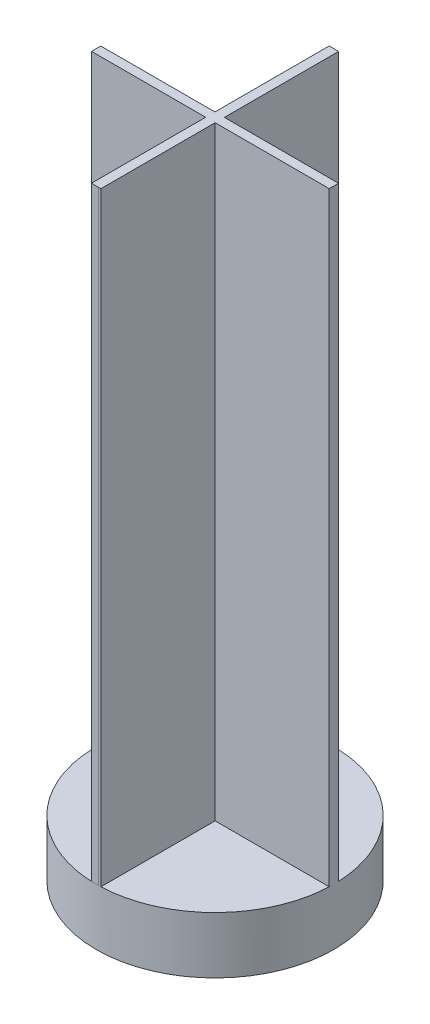
ISO-10303-21;
HEADER;
FILE_DESCRIPTION(('STEP AP214'),'2;1');
FILE_NAME('part.step','',(''),(''),'','','');
FILE_SCHEMA(('AUTOMOTIVE_DESIGN { 1 0 10303 214 1 1 1 1 }'));
ENDSEC;
DATA;
#1=APPLICATION_CONTEXT('core data for automotive mechanical design processes');
#2=APPLICATION_PROTOCOL_DEFINITION('international standard','automotive_design',2000,#1);
#3=PRODUCT_CONTEXT('',#1,'mechanical');
#4=PRODUCT('Part','Part','',(#3));
#5=PRODUCT_RELATED_PRODUCT_CATEGORY('part','',(#4));
#6=PRODUCT_DEFINITION_FORMATION('','',#4);
#7=PRODUCT_DEFINITION_CONTEXT('part definition',#1,'design');
#8=PRODUCT_DEFINITION('design','',#6,#7);
#9=PRODUCT_DEFINITION_SHAPE('','',#8);
#10=(LENGTH_UNIT() NAMED_UNIT(*) SI_UNIT(.MILLI.,.METRE.));
#11=(NAMED_UNIT(*) PLANE_ANGLE_UNIT() SI_UNIT($,.RADIAN.));
#12=(NAMED_UNIT(*) SI_UNIT($,.STERADIAN.) SOLID_ANGLE_UNIT());
#13=UNCERTAINTY_MEASURE_WITH_UNIT(LENGTH_MEASURE(1.E-05),#10,'distance_accuracy_value','');
#14=(GEOMETRIC_REPRESENTATION_CONTEXT(3) GLOBAL_UNCERTAINTY_ASSIGNED_CONTEXT((#13)) GLOBAL_UNIT_ASSIGNED_CONTEXT((#10,
#11,#12)) REPRESENTATION_CONTEXT('',''));
#15=CARTESIAN_POINT('',(0.,0.,0.));
#16=DIRECTION('',(0.,0.,1.));
#17=DIRECTION('',(1.,0.,0.));
#18=AXIS2_PLACEMENT_3D('',#15,#16,#17);
#19=CARTESIAN_POINT('',(-60.677031052405,-55.4908316577936,43.5017818594155));
#20=DIRECTION('',(0.,1.,0.));
#21=DIRECTION('',(0.,0.,1.));
#22=AXIS2_PLACEMENT_3D('',#19,#20,#21);
#23=PLANE('',#22);
#24=CARTESIAN_POINT('',(-20.7335158678154,-55.4908316577936,42.723897789482));
#25=CARTESIAN_POINT('',(-20.7452794277928,-55.4908316577936,42.4125955628972));
#26=CARTESIAN_POINT('',(-20.7642376178542,-55.4908316577936,42.1015552659481));
#27=CARTESIAN_POINT('',(-20.8165410225871,-55.4908316577936,41.4823149107754));
#28=CARTESIAN_POINT('',(-20.849811028162,-55.4908316577936,41.1741084907198));
#29=CARTESIAN_POINT('',(-20.9307331896234,-55.4908316577936,40.5605333148271));
#30=CARTESIAN_POINT('',(-20.9783415947686,-55.4908316577936,40.255158799326));
#31=CARTESIAN_POINT('',(-21.0879015910903,-55.4908316577936,39.6472471810869));
#32=CARTESIAN_POINT('',(-21.1498416036294,-55.4908316577936,39.3447079918745));
#33=CARTESIAN_POINT('',(-21.288033683538,-55.4908316577936,38.7424638498737));
#34=CARTESIAN_POINT('',(-21.364306039139,-55.4908316577936,38.4427635552714));
#35=CARTESIAN_POINT('',(-21.5311324613245,-55.4908316577936,37.8461847880544));
#36=CARTESIAN_POINT('',(-21.6217375547625,-55.4908316577936,37.5493205767422));
#37=CARTESIAN_POINT('',(-21.7970764175939,-55.4908316577936,37.0192356465199));
#38=CARTESIAN_POINT('',(-21.8793416515878,-55.4908316577936,36.7851945870201));
#39=CARTESIAN_POINT('',(-22.052875938155,-55.4908316577936,36.3188918143077));
#40=CARTESIAN_POINT('',(-22.1441957307309,-55.4908316577936,36.0866490191909));
#41=CARTESIAN_POINT('',(-22.3840215118189,-55.4908316577936,35.5076142492955));
#42=CARTESIAN_POINT('',(-22.5378776223811,-55.4908316577936,35.1630211416082));
#43=CARTESIAN_POINT('',(-22.8634002752838,-55.4908316577936,34.4856684349671));
#44=CARTESIAN_POINT('',(-23.0349178509987,-55.4908316577936,34.1528372813757));
#45=CARTESIAN_POINT('',(-23.3651473616546,-55.4908316577936,33.5543438602712));
#46=CARTESIAN_POINT('',(-23.5209129093476,-55.4908316577936,33.2870520365441));
#47=CARTESIAN_POINT('',(-23.8446246141413,-55.4908316577936,32.7605809662016));
#48=CARTESIAN_POINT('',(-24.0125491785997,-55.4908316577936,32.5013884542983));
#49=CARTESIAN_POINT('',(-24.3605480264003,-55.4908316577936,31.991106267374));
#50=CARTESIAN_POINT('',(-24.5406282741264,-55.4908316577936,31.7400206607801));
#51=CARTESIAN_POINT('',(-24.9129112956881,-55.4908316577936,31.245932966793));
#52=CARTESIAN_POINT('',(-25.1051457236619,-55.4908316577936,31.0029547353754));
#53=CARTESIAN_POINT('',(-25.5025429049437,-55.4908316577936,30.5240615438446));
#54=CARTESIAN_POINT('',(-25.7078075144622,-55.4908316577936,30.2882311357692));
#55=CARTESIAN_POINT('',(-26.1305094568579,-55.4908316577936,29.8246782425956));
#56=CARTESIAN_POINT('',(-26.3480227892681,-55.4908316577936,29.5970251137229));
#57=CARTESIAN_POINT('',(-26.7912632758206,-55.4908316577936,29.1537578605114));
#58=CARTESIAN_POINT('',(-27.0169037986522,-55.4908316577936,28.9380571024273));
#59=CARTESIAN_POINT('',(-27.4763206186723,-55.4908316577936,28.5187622579054));
#60=CARTESIAN_POINT('',(-27.7100298731406,-55.4908316577936,28.3150947726353));
#61=CARTESIAN_POINT('',(-28.1865477783414,-55.4908316577936,27.9190255317051));
#62=CARTESIAN_POINT('',(-28.4293502667884,-55.4908316577936,27.7266163652479));
#63=CARTESIAN_POINT('',(-28.9231100012591,-55.4908316577936,27.3539675738878));
#64=CARTESIAN_POINT('',(-29.1740438518854,-55.4908316577936,27.1736969562072));
#65=CARTESIAN_POINT('',(-29.6840460298808,-55.4908316577936,26.8253006712829));
#66=CARTESIAN_POINT('',(-29.9431107455028,-55.4908316577936,26.6571697181216));
#67=CARTESIAN_POINT('',(-30.4693494256853,-55.4908316577936,26.333028411458));
#68=CARTESIAN_POINT('',(-30.7365370981362,-55.4908316577936,26.177040332232));
#69=CARTESIAN_POINT('',(-31.3371028308648,-55.4908316577936,25.8450447018935));
#70=CARTESIAN_POINT('',(-31.6721850195755,-55.4908316577936,25.6721123368095));
#71=CARTESIAN_POINT('',(-32.3542342166158,-55.4908316577936,25.3439728610081));
#72=CARTESIAN_POINT('',(-32.701275094562,-55.4908316577936,25.188919363958));
#73=CARTESIAN_POINT('',(-33.2803227495023,-55.4908316577936,24.9490468600797));
#74=CARTESIAN_POINT('',(-33.510038104769,-55.4908316577936,24.8586520742345));
#75=CARTESIAN_POINT('',(-33.9712664806068,-55.4908316577936,24.6867764490576));
#76=CARTESIAN_POINT('',(-34.2027613077415,-55.4908316577936,24.6052468803915));
#77=CARTESIAN_POINT('',(-34.7301599950448,-55.4908316577936,24.4303260643861));
#78=CARTESIAN_POINT('',(-35.0269169262593,-55.4908316577936,24.339494595567));
#79=CARTESIAN_POINT('',(-35.6233091132688,-55.4908316577936,24.1722094272952));
#80=CARTESIAN_POINT('',(-35.922930282604,-55.4908316577936,24.0957054780134));
#81=CARTESIAN_POINT('',(-36.5250442269977,-55.4908316577936,23.9570437071814));
#82=CARTESIAN_POINT('',(-36.8275325109024,-55.4908316577936,23.8948663953389));
#83=CARTESIAN_POINT('',(-37.4353703665104,-55.4908316577936,23.7848254132964));
#84=CARTESIAN_POINT('',(-37.740722179288,-55.4908316577936,23.7369741239969));
#85=CARTESIAN_POINT('',(-38.3542800040165,-55.4908316577936,23.6555597655336));
#86=CARTESIAN_POINT('',(-38.6624919155786,-55.4908316577936,23.6220412385855));
#87=CARTESIAN_POINT('',(-39.2817713724816,-55.4908316577936,23.5692344209751));
#88=CARTESIAN_POINT('',(-39.5928454057531,-55.4908316577936,23.5500221034623));
#89=CARTESIAN_POINT('',(-39.9041870568331,-55.4908316577936,23.5380024442502));
#90=B_SPLINE_CURVE_WITH_KNOTS('',3,(#24,#25,#26,#27,#28,#29,#30,#31,#32,#33,#34,#35,#36,#37,#38,
#39,#40,#41,#42,#43,#44,#45,#46,#47,#48,#49,#50,#51,#52,#53,#54,#55,#56,#57,#58,#59,#60,#61,#62,
#63,#64,#65,#66,#67,#68,#69,#70,#71,#72,#73,#74,#75,#76,#77,#78,#79,#80,#81,#82,#83,#84,#85,#86,
#87,#88,#89),.UNSPECIFIED.,.F.,.F.,(4,2,2,2,2,2,2,2,2,2,2,2,2,2,2,2,2,2,2,2,2,2,2,2,2,2,2,2,2,2,
2,2,4),(0.,0.934504975178753,1.86415796135463,2.79100255329524,3.71710093756409,
4.64452027848448,5.57531893948107,6.31938896279196,7.06789359117786,8.1994320556373,
9.32210619806125,10.2498738264638,11.1760324784932,12.1026489158491,13.031786845362,
13.9693924849792,14.9136470834744,15.8497885844915,16.7794571380115,17.7085066879348,
18.6350863657348,19.5612601233219,20.4890946214983,21.6197037082976,22.759398701584,
23.4998367435445,24.2359737179861,25.1666625915118,26.0940235617331,27.0201153799168,
27.9470052542577,28.8767550697654,29.8114077841729),.UNSPECIFIED.);
#91=CARTESIAN_POINT('',(-20.7337624723655,-55.4908316577936,42.7239073980584));
#92=VERTEX_POINT('',#91);
#93=CARTESIAN_POINT('',(-39.9041963511059,-55.4908316577936,23.5382362039433));
#94=VERTEX_POINT('',#93);
#95=EDGE_CURVE('E49',#92,#94,#90,.T.);
#96=ORIENTED_EDGE('',*,*,#95,.T.);
#97=DIRECTION('',(0.,0.,1.));
#98=VECTOR('',#97,1.);
#99=CARTESIAN_POINT('',(-39.9041958539564,-55.4908316577936,0.));
#100=LINE('',#99,#98);
#101=CARTESIAN_POINT('',(-39.9041958539564,-55.4908316577936,42.7239068594155));
#102=VERTEX_POINT('',#101);
#103=EDGE_CURVE('E56',#94,#102,#100,.T.);
#104=ORIENTED_EDGE('',*,*,#103,.T.);
#105=DIRECTION('',(-1.,0.,0.));
#106=VECTOR('',#105,1.);
#107=CARTESIAN_POINT('',(0.,-55.4908316577936,42.7239068594155));
#108=LINE('',#107,#106);
#109=EDGE_CURVE('E164',#92,#102,#108,.T.);
#110=ORIENTED_EDGE('',*,*,#109,.F.);
#111=EDGE_LOOP('',(#96,#104,#110));
#112=FACE_BOUND('',#111,.T.);
#113=ADVANCED_FACE('F38',(#112),#23,.T.);
#114=CARTESIAN_POINT('',(-60.6623758400974,-55.4908316577936,44.2796659293489));
#115=CARTESIAN_POINT('',(-60.6506123055585,-55.4908316577936,44.5909674788356));
#116=CARTESIAN_POINT('',(-60.6316541724291,-55.4908316577936,44.902007099799));
#117=CARTESIAN_POINT('',(-60.5793509444297,-55.4908316577936,45.5212461154148));
#118=CARTESIAN_POINT('',(-60.5460810582315,-55.4908316577936,45.8294518718557));
#119=CARTESIAN_POINT('',(-60.4651591983496,-55.4908316577936,46.4430257329184));
#120=CARTESIAN_POINT('',(-60.4175509752602,-55.4908316577936,46.7483995971759));
#121=CARTESIAN_POINT('',(-60.307991405537,-55.4908316577936,47.3563099252973));
#122=CARTESIAN_POINT('',(-60.2460516376752,-55.4908316577936,47.6588484756561));
#123=CARTESIAN_POINT('',(-60.1078601093138,-55.4908316577936,48.2610913523281));
#124=CARTESIAN_POINT('',(-60.0315880609897,-55.4908316577936,48.5607910205575));
#125=CARTESIAN_POINT('',(-59.8647623153792,-55.4908316577936,49.1573685470708));
#126=CARTESIAN_POINT('',(-59.7741575918998,-55.4908316577936,49.4542321442643));
#127=CARTESIAN_POINT('',(-59.5988186340636,-55.4908316577936,49.9843184446083));
#128=CARTESIAN_POINT('',(-59.5165528342472,-55.4908316577936,50.218361453017));
#129=CARTESIAN_POINT('',(-59.3430172679428,-55.4908316577936,50.6846680943854));
#130=CARTESIAN_POINT('',(-59.2516967602823,-55.4908316577936,50.916912808831));
#131=CARTESIAN_POINT('',(-59.011871496993,-55.4908316577936,51.4959463287887));
#132=CARTESIAN_POINT('',(-58.8580168593905,-55.4908316577936,51.8405363651523));
#133=CARTESIAN_POINT('',(-58.5324974765071,-55.4908316577936,52.5178831444622));
#134=CARTESIAN_POINT('',(-58.3609816943504,-55.4908316577936,52.8507114402703));
#135=CARTESIAN_POINT('',(-58.0307547345483,-55.4908316577936,53.4492016866834));
#136=CARTESIAN_POINT('',(-57.8749898052803,-55.4908316577936,53.7164931125663));
#137=CARTESIAN_POINT('',(-57.5512793899911,-55.4908316577936,54.2429634221642));
#138=CARTESIAN_POINT('',(-57.3833554971485,-55.4908316577936,54.5021555714633));
#139=CARTESIAN_POINT('',(-57.035358044825,-55.4908316577936,55.0124370682635));
#140=CARTESIAN_POINT('',(-56.8552785216991,-55.4908316577936,55.2635223478526));
#141=CARTESIAN_POINT('',(-56.4829970017593,-55.4908316577936,55.7576094222915));
#142=CARTESIAN_POINT('',(-56.2907633517109,-55.4908316577936,56.0005873619121));
#143=CARTESIAN_POINT('',(-55.8933642993509,-55.4908316577936,56.4794841993756));
#144=CARTESIAN_POINT('',(-55.688096844387,-55.4908316577936,56.7153183823756));
#145=CARTESIAN_POINT('',(-55.2653888408836,-55.4908316577936,57.1788785790869));
#146=CARTESIAN_POINT('',(-55.0478722896254,-55.4908316577936,57.4065352337663));
#147=CARTESIAN_POINT('',(-54.604632765602,-55.4908316577936,57.849801524704));
#148=CARTESIAN_POINT('',(-54.3789967729509,-55.4908316577936,58.0654981435608));
#149=CARTESIAN_POINT('',(-53.9195893354124,-55.4908316577936,58.4847851888815));
#150=CARTESIAN_POINT('',(-53.6858849297296,-55.4908316577936,58.6884490101933));
#151=CARTESIAN_POINT('',(-53.2093728935975,-55.4908316577936,59.084514852421));
#152=CARTESIAN_POINT('',(-52.9665712632909,-55.4908316577936,59.2769240891118));
#153=CARTESIAN_POINT('',(-52.4728132795367,-55.4908316577936,59.6495730714358));
#154=CARTESIAN_POINT('',(-52.2218803221973,-55.4908316577936,59.8298438106661));
#155=CARTESIAN_POINT('',(-51.7118799675439,-55.4908316577936,60.1782403964075));
#156=CARTESIAN_POINT('',(-51.4528161827657,-55.4908316577936,60.3463715299659));
#157=CARTESIAN_POINT('',(-50.9265793906807,-55.4908316577936,60.6705132279386));
#158=CARTESIAN_POINT('',(-50.6593926762885,-55.4908316577936,60.8265015194783));
#159=CARTESIAN_POINT('',(-50.0588218756892,-55.4908316577936,61.1585017784865));
#160=CARTESIAN_POINT('',(-49.7237334397449,-55.4908316577936,61.3314381827468));
#161=CARTESIAN_POINT('',(-49.0416711117846,-55.4908316577936,61.6595846365642));
#162=CARTESIAN_POINT('',(-48.6946233448054,-55.4908316577936,61.8146410613462));
#163=CARTESIAN_POINT('',(-48.1155569173154,-55.4908316577936,62.0545221749155));
#164=CARTESIAN_POINT('',(-47.8858294749244,-55.4908316577936,62.1449221574728));
#165=CARTESIAN_POINT('',(-47.4245812962244,-55.4908316577936,62.316807193831));
#166=CARTESIAN_POINT('',(-47.1930788079382,-55.4908316577936,62.3983411225853));
#167=CARTESIAN_POINT('',(-46.6656589123714,-55.4908316577936,62.5732732106194));
#168=CARTESIAN_POINT('',(-46.3688883625285,-55.4908316577936,62.6641114498384));
#169=CARTESIAN_POINT('',(-45.7724756288436,-55.4908316577936,62.8314071099592));
#170=CARTESIAN_POINT('',(-45.4728476258834,-55.4908316577936,62.9079151159179));
#171=CARTESIAN_POINT('',(-44.8707267062499,-55.4908316577936,63.0465819095086));
#172=CARTESIAN_POINT('',(-44.5682383587629,-55.4908316577936,63.108760525482));
#173=CARTESIAN_POINT('',(-43.960407091061,-55.4908316577936,63.2188010358967));
#174=CARTESIAN_POINT('',(-43.6550619900343,-55.4908316577936,63.2666508825006));
#175=CARTESIAN_POINT('',(-43.0415243142871,-55.4908316577936,63.3480592747923));
#176=CARTESIAN_POINT('',(-42.7333258825989,-55.4908316577936,63.381573598883));
#177=CARTESIAN_POINT('',(-42.1140801561339,-55.4908316577936,63.434368968819));
#178=CARTESIAN_POINT('',(-41.8030264001867,-55.4908316577936,63.4535743420843));
#179=CARTESIAN_POINT('',(-41.4917051013596,-55.4908316577936,63.4655856597542));
#180=B_SPLINE_CURVE_WITH_KNOTS('',3,(#114,#115,#116,#117,#118,#119,#120,#121,#122,#123,#124,
#125,#126,#127,#128,#129,#130,#131,#132,#133,#134,#135,#136,#137,#138,#139,#140,#141,#142,#143,
#144,#145,#146,#147,#148,#149,#150,#151,#152,#153,#154,#155,#156,#157,#158,#159,#160,#161,#162,
#163,#164,#165,#166,#167,#168,#169,#170,#171,#172,#173,#174,#175,#176,#177,#178,#179),
.UNSPECIFIED.,.F.,.F.,(4,2,2,2,2,2,2,2,2,2,2,2,2,2,2,2,2,2,2,2,2,2,2,2,2,2,2,2,2,2,2,2,4),(0.,
0.934502942884559,1.86415391350205,2.79099649316754,3.71709285488847,4.64451014947887,
5.57530672705036,6.31938282484036,7.06789359244494,8.19942185939722,9.32208593299595,
10.2498515978775,11.1760082438814,12.1026226190896,13.0317584171021,13.9693781870187,
14.9136470872256,15.8497702045447,16.7794205906164,17.7084682549039,18.63504597254,
19.5612176815237,20.489050029324,21.6196812669384,22.7593986995601,23.4998762168199,
24.2360392449146,25.1667731116013,26.0941569211985,27.0202496500764,27.9471188787868,
28.8768270073151,29.8114176416814),.UNSPECIFIED.);
#181=CARTESIAN_POINT('',(-60.6621292355472,-55.4908316577936,44.2796563207725));
#182=VERTEX_POINT('',#181);
#183=CARTESIAN_POINT('',(-41.4916953227263,-55.4908316577936,63.465339717781));
#184=VERTEX_POINT('',#183);
#185=EDGE_CURVE('E277',#182,#184,#180,.T.);
#186=ORIENTED_EDGE('',*,*,#185,.T.);
#187=DIRECTION('',(0.,0.,-1.));
#188=VECTOR('',#187,1.);
#189=CARTESIAN_POINT('',(-41.4916958539564,-55.4908316577936,0.));
#190=LINE('',#189,#188);
#191=CARTESIAN_POINT('',(-41.4916958539564,-55.4908316577936,44.2796568594155));
#192=VERTEX_POINT('',#191);
#193=EDGE_CURVE('E292',#184,#192,#190,.T.);
#194=ORIENTED_EDGE('',*,*,#193,.T.);
#195=DIRECTION('',(1.,0.,0.));
#196=VECTOR('',#195,1.);
#197=CARTESIAN_POINT('',(0.,-55.4908316577936,44.2796568594155));
#198=LINE('',#197,#196);
#199=EDGE_CURVE('E283',#182,#192,#198,.T.);
#200=ORIENTED_EDGE('',*,*,#199,.F.);
#201=EDGE_LOOP('',(#186,#194,#200));
#202=FACE_BOUND('',#201,.T.);
#203=ADVANCED_FACE('F350',(#202),#23,.T.);
#204=DIRECTION('',(-1.,0.,0.));
#205=VECTOR('',#204,1.);
#206=CARTESIAN_POINT('',(0.,-55.4908316577936,42.7239068594155));
#207=LINE('',#206,#205);
#208=CARTESIAN_POINT('',(-41.4916958539564,-55.4908316577936,42.7239068594155));
#209=VERTEX_POINT('',#208);
#210=CARTESIAN_POINT('',(-60.6621078343695,-55.4908316577936,42.7239073354251));
#211=VERTEX_POINT('',#210);
#212=EDGE_CURVE('E293',#209,#211,#207,.T.);
#213=ORIENTED_EDGE('',*,*,#212,.F.);
#214=DIRECTION('',(0.,0.,-1.));
#215=VECTOR('',#214,1.);
#216=CARTESIAN_POINT('',(-41.4916958539564,-55.4908316577936,0.));
#217=LINE('',#216,#215);
#218=CARTESIAN_POINT('',(-41.4916952891315,-55.4908316577936,23.538214518643));
#219=VERTEX_POINT('',#218);
#220=EDGE_CURVE('E144',#209,#219,#217,.T.);
#221=ORIENTED_EDGE('',*,*,#220,.T.);
#222=CARTESIAN_POINT('',(-41.4917054441311,-55.4908316577936,23.5379591105629));
#223=CARTESIAN_POINT('',(-41.8029653857158,-55.4908316577936,23.5499645486898));
#224=CARTESIAN_POINT('',(-42.1139576540318,-55.4908316577936,23.569165591204));
#225=CARTESIAN_POINT('',(-42.7331019503782,-55.4908316577936,23.6219541629956));
#226=CARTESIAN_POINT('',(-43.0412603552457,-55.4908316577936,23.6554670083335));
#227=CARTESIAN_POINT('',(-43.6547394770576,-55.4908316577936,23.7368743116619));
#228=CARTESIAN_POINT('',(-43.9600659173957,-55.4908316577936,23.7847255615575));
#229=CARTESIAN_POINT('',(-44.567881448113,-55.4908316577936,23.8947706963278));
#230=CARTESIAN_POINT('',(-44.8703725359329,-55.4908316577936,23.9569535472998));
#231=CARTESIAN_POINT('',(-45.4725205273014,-55.4908316577936,24.0956307334581));
#232=CARTESIAN_POINT('',(-45.7721726327611,-55.4908316577936,24.172145889338));
#233=CARTESIAN_POINT('',(-46.3686553459997,-55.4908316577936,24.339457449719));
#234=CARTESIAN_POINT('',(-46.6654715072982,-55.4908316577936,24.4303053876427));
#235=CARTESIAN_POINT('',(-47.192953279431,-55.4908316577936,24.605244651021));
#236=CARTESIAN_POINT('',(-47.42447202098,-55.4908316577936,24.6867759497907));
#237=CARTESIAN_POINT('',(-47.8857677353458,-55.4908316577936,24.8586517413821));
#238=CARTESIAN_POINT('',(-48.1155263271859,-55.4908316577936,24.9490454735234));
#239=CARTESIAN_POINT('',(-48.6945523888613,-55.4908316577936,25.1888677194345));
#240=CARTESIAN_POINT('',(-49.0415305415346,-55.4908316577936,25.3438682137773));
#241=CARTESIAN_POINT('',(-49.7234854588732,-55.4908316577936,25.6719322191849));
#242=CARTESIAN_POINT('',(-50.0585351654151,-55.4908316577936,25.8448440314058));
#243=CARTESIAN_POINT('',(-50.6590345568157,-55.4908316577936,26.1768033913067));
#244=CARTESIAN_POINT('',(-50.9261889246749,-55.4908316577936,26.3327748449787));
#245=CARTESIAN_POINT('',(-51.4523855010648,-55.4908316577936,26.656897930762));
#246=CARTESIAN_POINT('',(-51.7114407039751,-55.4908316577936,26.8250284485307));
#247=CARTESIAN_POINT('',(-52.2214484760208,-55.4908316577936,27.1734386685033));
#248=CARTESIAN_POINT('',(-52.4723966603176,-55.4908316577936,27.3537247878007));
#249=CARTESIAN_POINT('',(-52.9662099771733,-55.4908316577936,27.7264192380829));
#250=CARTESIAN_POINT('',(-53.2090509009764,-55.4908316577936,27.9188596388155));
#251=CARTESIAN_POINT('',(-53.6856348533605,-55.4908316577936,28.3149781872562));
#252=CARTESIAN_POINT('',(-53.9193722203551,-55.4908316577936,28.5186631435732));
#253=CARTESIAN_POINT('',(-54.3788750883864,-55.4908316577936,28.9380013254859));
#254=CARTESIAN_POINT('',(-54.6045727800948,-55.4908316577936,29.1537287959313));
#255=CARTESIAN_POINT('',(-55.0478393452229,-55.4908316577936,29.596968727613));
#256=CARTESIAN_POINT('',(-55.2653254596911,-55.4908316577936,29.8245639640135));
#257=CARTESIAN_POINT('',(-55.6879832963103,-55.4908316577936,30.2880297873935));
#258=CARTESIAN_POINT('',(-55.8932301487244,-55.4908316577936,30.5238318052535));
#259=CARTESIAN_POINT('',(-56.2905779390157,-55.4908316577936,31.0026590008567));
#260=CARTESIAN_POINT('',(-56.482781348594,-55.4908316577936,31.245599116265));
#261=CARTESIAN_POINT('',(-56.8550191535451,-55.4908316577936,31.7396338606436));
#262=CARTESIAN_POINT('',(-57.0350841249854,-55.4908316577936,31.9907054464979));
#263=CARTESIAN_POINT('',(-57.3830694965341,-55.4908316577936,32.5009826611002));
#264=CARTESIAN_POINT('',(-57.5509947291693,-55.4908316577936,32.7601849936227));
#265=CARTESIAN_POINT('',(-57.8747251306888,-55.4908316577936,33.2866987781723));
#266=CARTESIAN_POINT('',(-58.0305075468225,-55.4908316577936,33.5540242078442));
#267=CARTESIAN_POINT('',(-58.3607737458078,-55.4908316577936,34.1525843536084));
#268=CARTESIAN_POINT('',(-58.532312028508,-55.4908316577936,34.4854480877429));
#269=CARTESIAN_POINT('',(-58.8579100154867,-55.4908316577936,35.1628948528754));
#270=CARTESIAN_POINT('',(-59.0118188795376,-55.4908316577936,35.5075503454486));
#271=CARTESIAN_POINT('',(-59.2516942159813,-55.4908316577936,36.0866050957093));
#272=CARTESIAN_POINT('',(-59.3430147305636,-55.4908316577936,36.3188033526964));
#273=CARTESIAN_POINT('',(-59.5165482372457,-55.4908316577936,36.7850365726055));
#274=CARTESIAN_POINT('',(-59.5988114414851,-55.4908316577936,37.019052811328));
#275=CARTESIAN_POINT('',(-59.7741316595145,-55.4908316577936,37.5490541259781));
#276=CARTESIAN_POINT('',(-59.864720397222,-55.4908316577936,37.8458594775943));
#277=CARTESIAN_POINT('',(-60.0315206651515,-55.4908316577936,38.4423484581925));
#278=CARTESIAN_POINT('',(-60.1077819376844,-55.4908316577936,38.7420181850726));
#279=CARTESIAN_POINT('',(-60.2459588593343,-55.4908316577936,39.3442290159641));
#280=CARTESIAN_POINT('',(-60.3078934658551,-55.4908316577936,39.6467657676836));
#281=CARTESIAN_POINT('',(-60.4174495852669,-55.4908316577936,40.2547004429026));
#282=CARTESIAN_POINT('',(-60.465058172646,-55.4908316577936,40.5601006953677));
#283=CARTESIAN_POINT('',(-60.545987684047,-55.4908316577936,41.1737553026097));
#284=CARTESIAN_POINT('',(-60.5792635238848,-55.4908316577936,41.4820155921061));
#285=CARTESIAN_POINT('',(-60.6315854877596,-55.4908316577936,42.1013918324998));
#286=CARTESIAN_POINT('',(-60.6505551146753,-55.4908316577936,42.4125142552474));
#287=CARTESIAN_POINT('',(-60.6623330726194,-55.4908316577936,42.7238985593444));
#288=B_SPLINE_CURVE_WITH_KNOTS('',3,(#222,#223,#224,#225,#226,#227,#228,#229,#230,#231,#232,
#233,#234,#235,#236,#237,#238,#239,#240,#241,#242,#243,#244,#245,#246,#247,#248,#249,#250,#251,
#252,#253,#254,#255,#256,#257,#258,#259,#260,#261,#262,#263,#264,#265,#266,#267,#268,#269,#270,
#271,#272,#273,#274,#275,#276,#277,#278,#279,#280,#281,#282,#283,#284,#285,#286,#287),
.UNSPECIFIED.,.F.,.F.,(4,2,2,2,2,2,2,2,2,2,2,2,2,2,2,2,2,2,2,2,2,2,2,2,2,2,2,2,2,2,2,2,4),(0.,
0.934405747697195,1.86399390650463,2.79080849582995,3.71691190004752,4.6443712479147,
5.5752446350705,6.31145132217926,7.05200909173284,8.19146678933021,9.32196014206599,
10.249683187866,11.1758322225705,12.102474070096,13.0316722658609,13.9614393999346,
14.8977605953278,15.8418328623785,16.7793387095977,17.7083291506653,18.634884587123,
19.5610691304996,20.4889493675323,21.6117396987061,22.7435141929983,23.491895082173,
24.2358925107618,25.1665078193855,26.0938299545352,27.0199179235524,27.9468389583249,
28.8766547343661,29.811407773608),.UNSPECIFIED.);
#289=EDGE_CURVE('E273',#219,#211,#288,.T.);
#290=ORIENTED_EDGE('',*,*,#289,.T.);
#291=EDGE_LOOP('',(#213,#221,#290));
#292=FACE_BOUND('',#291,.T.);
#293=ADVANCED_FACE('F352',(#292),#23,.T.);
#294=DIRECTION('',(1.,0.,0.));
#295=VECTOR('',#294,1.);
#296=CARTESIAN_POINT('',(0.,-55.4908316577936,44.2796568594155));
#297=LINE('',#296,#295);
#298=CARTESIAN_POINT('',(-39.9041958539564,-55.4908316577936,44.2796568594155));
#299=VERTEX_POINT('',#298);
#300=CARTESIAN_POINT('',(-20.7337838735465,-55.4908316577936,44.2796563834872));
#301=VERTEX_POINT('',#300);
#302=EDGE_CURVE('E63',#299,#301,#297,.T.);
#303=ORIENTED_EDGE('',*,*,#302,.F.);
#304=DIRECTION('',(0.,0.,1.));
#305=VECTOR('',#304,1.);
#306=CARTESIAN_POINT('',(-39.9041958539564,-55.4908316577936,0.));
#307=LINE('',#306,#305);
#308=CARTESIAN_POINT('',(-39.9041963801923,-55.4908316577936,63.4653369988007));
#309=VERTEX_POINT('',#308);
#310=EDGE_CURVE('E300',#299,#309,#307,.T.);
#311=ORIENTED_EDGE('',*,*,#310,.T.);
#312=CARTESIAN_POINT('',(-39.9041867094856,-55.4908316577936,63.4655802262834));
#313=CARTESIAN_POINT('',(-39.5929064217623,-55.4908316577936,63.4535664509962));
#314=CARTESIAN_POINT('',(-39.2818938821793,-55.4908316577936,63.4343584683471));
#315=CARTESIAN_POINT('',(-38.6627158663365,-55.4908316577936,63.3815584558685));
#316=CARTESIAN_POINT('',(-38.3545439864746,-55.4908316577936,63.3480414107742));
#317=CARTESIAN_POINT('',(-37.7410447242613,-55.4908316577936,63.2666281461835));
#318=CARTESIAN_POINT('',(-37.4357115758532,-55.4908316577936,63.2187754555413));
#319=CARTESIAN_POINT('',(-36.8278894634286,-55.4908316577936,63.108729851883));
#320=CARTESIAN_POINT('',(-36.5253984416946,-55.4908316577936,63.046548305871));
#321=CARTESIAN_POINT('',(-35.923257429405,-55.4908316577936,62.9078761430577));
#322=CARTESIAN_POINT('',(-35.6236121589098,-55.4908316577936,62.831365043549));
#323=CARTESIAN_POINT('',(-35.0271499938235,-55.4908316577936,62.6640639734651));
#324=CARTESIAN_POINT('',(-34.7303474513325,-55.4908316577936,62.5732228045231));
#325=CARTESIAN_POINT('',(-34.2028868805429,-55.4908316577936,62.3982948077423));
#326=CARTESIAN_POINT('',(-33.9713757930654,-55.4908316577936,62.316767864922));
#327=CARTESIAN_POINT('',(-33.5100998643585,-55.4908316577936,62.1449014752937));
#328=CARTESIAN_POINT('',(-33.2803533496441,-55.4908316577936,62.054512934472));
#329=CARTESIAN_POINT('',(-32.7013460506237,-55.4908316577936,61.8146992918424));
#330=CARTESIAN_POINT('',(-32.3543747866141,-55.4908316577936,61.6597017252433));
#331=CARTESIAN_POINT('',(-31.672433000959,-55.4908316577936,61.3316446984893));
#332=CARTESIAN_POINT('',(-31.3373895427049,-55.4908316577936,61.1587369262335));
#333=CARTESIAN_POINT('',(-30.7368952211132,-55.4908316577936,60.8267821967638));
#334=CARTESIAN_POINT('',(-30.4697398961552,-55.4908316577936,60.6708109562629));
#335=CARTESIAN_POINT('',(-29.9435414335055,-55.4908316577936,60.3466882634028));
#336=CARTESIAN_POINT('',(-29.6844853006298,-55.4908316577936,60.1785579267822));
#337=CARTESIAN_POINT('',(-29.1744757068984,-55.4908316577936,59.8301480090622));
#338=CARTESIAN_POINT('',(-28.9235266300952,-55.4908316577936,59.6498620119899));
#339=CARTESIAN_POINT('',(-28.4297115639875,-55.4908316577936,59.2771677539475));
#340=CARTESIAN_POINT('',(-28.1868697827315,-55.4908316577936,59.0847274240398));
#341=CARTESIAN_POINT('',(-27.7102799603582,-55.4908316577936,58.688605476158));
#342=CARTESIAN_POINT('',(-27.4765377429928,-55.4908316577936,58.4849168545278));
#343=CARTESIAN_POINT('',(-27.0170254882932,-55.4908316577936,58.0655708701587));
#344=CARTESIAN_POINT('',(-26.7913232638508,-55.4908316577936,57.8498392585316));
#345=CARTESIAN_POINT('',(-26.3480557336677,-55.4908316577936,57.4065983621348));
#346=CARTESIAN_POINT('',(-26.1305728379982,-55.4908316577936,57.1790066511879));
#347=CARTESIAN_POINT('',(-25.7079210627404,-55.4908316577936,56.7155481314673));
#348=CARTESIAN_POINT('',(-25.5026770560332,-55.4908316577936,56.4797498890436));
#349=CARTESIAN_POINT('',(-25.1053311373643,-55.4908316577936,56.000926340663));
#350=CARTESIAN_POINT('',(-24.9131269502157,-55.4908316577936,55.7579859341778));
#351=CARTESIAN_POINT('',(-24.5408876442958,-55.4908316577936,55.2639505715832));
#352=CARTESIAN_POINT('',(-24.360821948558,-55.4908316577936,55.0128786593302));
#353=CARTESIAN_POINT('',(-24.0128351820747,-55.4908316577936,54.5026007557117));
#354=CARTESIAN_POINT('',(-23.8449092780695,-55.4908316577936,54.2433980610807));
#355=CARTESIAN_POINT('',(-23.5211775874751,-55.4908316577936,53.716883516672));
#356=CARTESIAN_POINT('',(-23.3653945531072,-55.4908316577936,53.4495576895397));
#357=CARTESIAN_POINT('',(-23.0351258029934,-55.4908316577936,52.8509943686186));
#358=CARTESIAN_POINT('',(-22.8635857263075,-55.4908316577936,52.5181277758345));
#359=CARTESIAN_POINT('',(-22.5379844679839,-55.4908316577936,51.8406750810335));
#360=CARTESIAN_POINT('',(-22.384074130129,-55.4908316577936,51.4960165156386));
#361=CARTESIAN_POINT('',(-22.1441982750831,-55.4908316577936,50.9169605137374));
#362=CARTESIAN_POINT('',(-22.0528784756328,-55.4908316577936,50.6847641758938));
#363=CARTESIAN_POINT('',(-21.879346248763,-55.4908316577936,50.218534824584));
#364=CARTESIAN_POINT('',(-21.7970836103603,-55.4908316577936,49.9845205349036));
#365=CARTESIAN_POINT('',(-21.6217634873174,-55.4908316577936,49.454520590851));
#366=CARTESIAN_POINT('',(-21.5311743796691,-55.4908316577936,49.1577146254396));
#367=CARTESIAN_POINT('',(-21.3643734351849,-55.4908316577936,48.5612244046627));
#368=CARTESIAN_POINT('',(-21.288111855385,-55.4908316577936,48.2615540516085));
#369=CARTESIAN_POINT('',(-21.1499343821895,-55.4908316577936,47.6593419556638));
#370=CARTESIAN_POINT('',(-21.0879995309912,-55.4908316577936,47.3568045651652));
#371=CARTESIAN_POINT('',(-20.9784429849619,-55.4908316577936,46.7488685998549));
#372=CARTESIAN_POINT('',(-20.9308342155171,-55.4908316577936,46.4434676960962));
#373=CARTESIAN_POINT('',(-20.8499044024975,-55.4908316577936,45.8298117738017));
#374=CARTESIAN_POINT('',(-20.8166284432626,-55.4908316577936,45.5215508205165));
#375=CARTESIAN_POINT('',(-20.7643063025953,-55.4908316577936,44.9021732400937));
#376=CARTESIAN_POINT('',(-20.7453366187171,-55.4908316577936,44.5910501410612));
#377=CARTESIAN_POINT('',(-20.7335586352969,-55.4908316577936,44.2796651595678));
#378=B_SPLINE_CURVE_WITH_KNOTS('',3,(#312,#313,#314,#315,#316,#317,#318,#319,#320,#321,#322,
#323,#324,#325,#326,#327,#328,#329,#330,#331,#332,#333,#334,#335,#336,#337,#338,#339,#340,#341,
#342,#343,#344,#345,#346,#347,#348,#349,#350,#351,#352,#353,#354,#355,#356,#357,#358,#359,#360,
#361,#362,#363,#364,#365,#366,#367,#368,#369,#370,#371,#372,#373,#374,#375,#376,#377),
.UNSPECIFIED.,.F.,.F.,(4,2,2,2,2,2,2,2,2,2,2,2,2,2,2,2,2,2,2,2,2,2,2,2,2,2,2,2,2,2,2,2,4),(0.,
0.934467808751024,1.86409763905308,2.79093286215281,3.71703534771506,4.64447185246688,
5.575300247244,6.31148090504766,7.05199923324201,8.19143449253494,9.32190569062038,
10.2496308829968,11.1757819628354,12.1024257674158,13.0316258460926,13.9614111539145,
14.8977507426353,15.8418087088829,16.7793004241707,17.7082929943766,18.6348504909568,
19.5610370386917,20.4889192379531,21.6117196408704,22.7435043378352,23.4918790882687,
24.2358704420036,25.1664878331075,26.0938120139959,27.019902005336,27.9468250525329,
28.8766428446589,29.8113979170965),.UNSPECIFIED.);
#379=EDGE_CURVE('E11',#309,#301,#378,.T.);
#380=ORIENTED_EDGE('',*,*,#379,.T.);
#381=EDGE_LOOP('',(#303,#311,#380));
#382=FACE_BOUND('',#381,.T.);
#383=ADVANCED_FACE('F40',(#382),#23,.T.);
#384=CARTESIAN_POINT('',(-40.6979458539564,-55.4908316577936,43.5017818594155));
#385=DIRECTION('',(0.,1.,0.));
#386=DIRECTION('',(0.,0.,1.));
#387=AXIS2_PLACEMENT_3D('',#384,#385,#386);
#388=CYLINDRICAL_SURFACE('',#387,19.9790851984486);
#389=CARTESIAN_POINT('',(-40.6979458539564,-65.0158316577937,43.5017818594155));
#390=DIRECTION('',(0.,1.,0.));
#391=DIRECTION('',(0.,0.,1.));
#392=AXIS2_PLACEMENT_3D('',#389,#390,#391);
#393=CIRCLE('',#392,19.9790851984486);
#394=CARTESIAN_POINT('',(-40.6979458539564,-65.0158316577937,63.4808670578641));
#395=VERTEX_POINT('',#394);
#396=EDGE_CURVE('E147',#395,#395,#393,.T.);
#397=ORIENTED_EDGE('',*,*,#396,.T.);
#398=EDGE_LOOP('',(#397));
#399=FACE_BOUND('',#398,.T.);
#400=ORIENTED_EDGE('',*,*,#379,.F.);
#401=DIRECTION('',(0.,-1.,0.));
#402=VECTOR('',#401,1.);
#403=CARTESIAN_POINT('',(-39.9041958539564,46.1091683422063,63.4650933658858));
#404=LINE('',#403,#402);
#405=CARTESIAN_POINT('',(-39.9041958539564,46.1091683422063,63.4650933658858));
#406=VERTEX_POINT('',#405);
#407=EDGE_CURVE('E198',#406,#309,#404,.T.);
#408=ORIENTED_EDGE('',*,*,#407,.F.);
#409=CARTESIAN_POINT('',(-40.6979458539564,46.1091683422063,43.5017818594155));
#410=DIRECTION('',(0.,1.,0.));
#411=DIRECTION('',(0.,0.,1.));
#412=AXIS2_PLACEMENT_3D('',#409,#410,#411);
#413=CIRCLE('',#412,19.9790851984486);
#414=CARTESIAN_POINT('',(-40.3010316752484,46.1091683422063,63.4769240241564));
#415=VERTEX_POINT('',#414);
#416=EDGE_CURVE('E176',#415,#406,#413,.T.);
#417=ORIENTED_EDGE('',*,*,#416,.F.);
#418=DIRECTION('',(0.,-1.,0.));
#419=VECTOR('',#418,1.);
#420=CARTESIAN_POINT('',(-40.3010316752484,46.1091683422063,63.4769240241564));
#421=LINE('',#420,#419);
#422=CARTESIAN_POINT('',(-40.3010304631502,-55.4908316577936,63.4769916253806));
#423=VERTEX_POINT('',#422);
#424=EDGE_CURVE('E214',#415,#423,#421,.T.);
#425=ORIENTED_EDGE('',*,*,#424,.T.);
#426=CARTESIAN_POINT('',(-40.6979458539564,-55.4908316577936,43.5017818594155));
#427=DIRECTION('',(0.,-1.,0.));
#428=DIRECTION('',(0.0198664775515026,0.,0.999802642059769));
#429=AXIS2_PLACEMENT_3D('',#426,#427,#428);
#430=CIRCLE('',#429,19.9790851984486);
#431=EDGE_CURVE('E209',#423,#184,#430,.T.);
#432=ORIENTED_EDGE('',*,*,#431,.T.);
#433=ORIENTED_EDGE('',*,*,#185,.F.);
#434=DIRECTION('',(0.,-1.,0.));
#435=VECTOR('',#434,1.);
#436=CARTESIAN_POINT('',(-60.6618822356233,46.1091683422063,44.2796568594155));
#437=LINE('',#436,#435);
#438=CARTESIAN_POINT('',(-60.6618822356233,46.1091683422063,44.2796568594155));
#439=VERTEX_POINT('',#438);
#440=EDGE_CURVE('E202',#439,#182,#437,.T.);
#441=ORIENTED_EDGE('',*,*,#440,.F.);
#442=CARTESIAN_POINT('',(-40.6979458539564,46.1091683422063,43.5017818594155));
#443=DIRECTION('',(0.,1.,0.));
#444=DIRECTION('',(0.,0.,1.));
#445=AXIS2_PLACEMENT_3D('',#442,#443,#444);
#446=CIRCLE('',#445,19.9790851984486);
#447=CARTESIAN_POINT('',(-60.6618822356233,46.1091683422063,42.7239068594155));
#448=VERTEX_POINT('',#447);
#449=EDGE_CURVE('E156',#448,#439,#446,.T.);
#450=ORIENTED_EDGE('',*,*,#449,.F.);
#451=DIRECTION('',(0.,-1.,0.));
#452=VECTOR('',#451,1.);
#453=CARTESIAN_POINT('',(-60.6618822356233,46.1091683422063,42.7239068594155));
#454=LINE('',#453,#452);
#455=EDGE_CURVE('E148',#448,#211,#454,.T.);
#456=ORIENTED_EDGE('',*,*,#455,.T.);
#457=ORIENTED_EDGE('',*,*,#289,.F.);
#458=DIRECTION('',(0.,-1.,0.));
#459=VECTOR('',#458,1.);
#460=CARTESIAN_POINT('',(-41.4916958539564,46.1091683422063,23.5384703529452));
#461=LINE('',#460,#459);
#462=CARTESIAN_POINT('',(-41.4916958539564,46.1091683422063,23.5384703529452));
#463=VERTEX_POINT('',#462);
#464=EDGE_CURVE('E191',#463,#219,#461,.T.);
#465=ORIENTED_EDGE('',*,*,#464,.F.);
#466=CARTESIAN_POINT('',(-40.6979458539564,46.1091683422063,43.5017818594155));
#467=DIRECTION('',(0.,1.,0.));
#468=DIRECTION('',(0.,0.,1.));
#469=AXIS2_PLACEMENT_3D('',#466,#467,#468);
#470=CIRCLE('',#469,19.9790851984486);
#471=CARTESIAN_POINT('',(-39.9041958539564,46.1091683422063,23.5384703529452));
#472=VERTEX_POINT('',#471);
#473=EDGE_CURVE('E161',#472,#463,#470,.T.);
#474=ORIENTED_EDGE('',*,*,#473,.F.);
#475=DIRECTION('',(0.,-1.,0.));
#476=VECTOR('',#475,1.);
#477=CARTESIAN_POINT('',(-39.9041958539564,46.1091683422063,23.5384703529452));
#478=LINE('',#477,#476);
#479=EDGE_CURVE('E195',#472,#94,#478,.T.);
#480=ORIENTED_EDGE('',*,*,#479,.T.);
#481=ORIENTED_EDGE('',*,*,#95,.F.);
#482=DIRECTION('',(0.,-1.,0.));
#483=VECTOR('',#482,1.);
#484=CARTESIAN_POINT('',(-20.7340094722895,46.1091683422063,42.7239068594155));
#485=LINE('',#484,#483);
#486=CARTESIAN_POINT('',(-20.7340094722895,46.1091683422063,42.7239068594155));
#487=VERTEX_POINT('',#486);
#488=EDGE_CURVE('E194',#487,#92,#485,.T.);
#489=ORIENTED_EDGE('',*,*,#488,.F.);
#490=CARTESIAN_POINT('',(-40.6979458539564,46.1091683422063,43.5017818594155));
#491=DIRECTION('',(0.,1.,0.));
#492=DIRECTION('',(0.,0.,1.));
#493=AXIS2_PLACEMENT_3D('',#490,#491,#492);
#494=CIRCLE('',#493,19.9790851984486);
#495=CARTESIAN_POINT('',(-20.7340094722895,46.1091683422063,44.2796568594155));
#496=VERTEX_POINT('',#495);
#497=EDGE_CURVE('E183',#496,#487,#494,.T.);
#498=ORIENTED_EDGE('',*,*,#497,.F.);
#499=DIRECTION('',(0.,-1.,0.));
#500=VECTOR('',#499,1.);
#501=CARTESIAN_POINT('',(-20.7340094722895,46.1091683422063,44.2796568594155));
#502=LINE('',#501,#500);
#503=EDGE_CURVE('E199',#496,#301,#502,.T.);
#504=ORIENTED_EDGE('',*,*,#503,.T.);
#505=EDGE_LOOP('',(#400,#408,#417,#425,#432,#433,#441,#450,#456,#457,#465,#474,#480,#481,#489,
#498,#504));
#506=FACE_BOUND('',#505,.T.);
#507=ADVANCED_FACE('F242',(#399,#506),#388,.T.);
#508=CARTESIAN_POINT('',(-40.6979458539564,-65.0158316577937,43.5017818594155));
#509=DIRECTION('',(0.,1.,0.));
#510=DIRECTION('',(0.,0.,1.));
#511=AXIS2_PLACEMENT_3D('',#508,#509,#510);
#512=CONICAL_SURFACE('',#511,19.9790851984486,1.38235941432645);
#513=CARTESIAN_POINT('',(-40.6979458539564,-68.8258316577936,43.5017818594155));
#514=VERTEX_POINT('',#513);
#515=VERTEX_LOOP('',#514);
#516=FACE_BOUND('',#515,.T.);
#517=ORIENTED_EDGE('',*,*,#396,.F.);
#518=EDGE_LOOP('',(#517));
#519=FACE_BOUND('',#518,.T.);
#520=ADVANCED_FACE('F240',(#516,#519),#512,.T.);
#521=CARTESIAN_POINT('',(-41.4916958539564,46.1091683422063,0.));
#522=DIRECTION('',(-1.,0.,0.));
#523=DIRECTION('',(0.,0.,1.));
#524=AXIS2_PLACEMENT_3D('',#521,#522,#523);
#525=PLANE('',#524);
#526=ORIENTED_EDGE('',*,*,#220,.F.);
#527=DIRECTION('',(0.,-1.,0.));
#528=VECTOR('',#527,1.);
#529=CARTESIAN_POINT('',(-41.4916958539564,46.1091683422063,42.7239068594155));
#530=LINE('',#529,#528);
#531=CARTESIAN_POINT('',(-41.4916958539564,46.1091683422063,42.7239068594155));
#532=VERTEX_POINT('',#531);
#533=EDGE_CURVE('E138',#532,#209,#530,.T.);
#534=ORIENTED_EDGE('',*,*,#533,.F.);
#535=DIRECTION('',(0.,0.,-1.));
#536=VECTOR('',#535,1.);
#537=CARTESIAN_POINT('',(-41.4916958539564,46.1091683422063,0.));
#538=LINE('',#537,#536);
#539=EDGE_CURVE('E143',#532,#463,#538,.T.);
#540=ORIENTED_EDGE('',*,*,#539,.T.);
#541=ORIENTED_EDGE('',*,*,#464,.T.);
#542=EDGE_LOOP('',(#526,#534,#540,#541));
#543=FACE_BOUND('',#542,.T.);
#544=ADVANCED_FACE('F140',(#543),#525,.T.);
#545=CARTESIAN_POINT('',(0.,46.1091683422063,42.7239068594155));
#546=DIRECTION('',(0.,0.,1.));
#547=DIRECTION('',(1.,0.,0.));
#548=AXIS2_PLACEMENT_3D('',#545,#546,#547);
#549=PLANE('',#548);
#550=ORIENTED_EDGE('',*,*,#212,.T.);
#551=ORIENTED_EDGE('',*,*,#455,.F.);
#552=DIRECTION('',(-1.,0.,0.));
#553=VECTOR('',#552,1.);
#554=CARTESIAN_POINT('',(0.,46.1091683422063,42.7239068594155));
#555=LINE('',#554,#553);
#556=EDGE_CURVE('E151',#532,#448,#555,.T.);
#557=ORIENTED_EDGE('',*,*,#556,.F.);
#558=ORIENTED_EDGE('',*,*,#533,.T.);
#559=EDGE_LOOP('',(#550,#551,#557,#558));
#560=FACE_BOUND('',#559,.T.);
#561=ADVANCED_FACE('F152',(#560),#549,.F.);
#562=CARTESIAN_POINT('',(0.,46.1091683422063,44.2796568594155));
#563=DIRECTION('',(0.,0.,-1.));
#564=DIRECTION('',(-1.,0.,0.));
#565=AXIS2_PLACEMENT_3D('',#562,#563,#564);
#566=PLANE('',#565);
#567=ORIENTED_EDGE('',*,*,#199,.T.);
#568=DIRECTION('',(0.,-1.,0.));
#569=VECTOR('',#568,1.);
#570=CARTESIAN_POINT('',(-41.4916958539564,46.1091683422063,44.2796568594155));
#571=LINE('',#570,#569);
#572=CARTESIAN_POINT('',(-41.4916958539564,46.1091683422063,44.2796568594155));
#573=VERTEX_POINT('',#572);
#574=EDGE_CURVE('E200',#573,#192,#571,.T.);
#575=ORIENTED_EDGE('',*,*,#574,.F.);
#576=DIRECTION('',(1.,0.,0.));
#577=VECTOR('',#576,1.);
#578=CARTESIAN_POINT('',(0.,46.1091683422063,44.2796568594155));
#579=LINE('',#578,#577);
#580=EDGE_CURVE('E168',#439,#573,#579,.T.);
#581=ORIENTED_EDGE('',*,*,#580,.F.);
#582=ORIENTED_EDGE('',*,*,#440,.T.);
#583=EDGE_LOOP('',(#567,#575,#581,#582));
#584=FACE_BOUND('',#583,.T.);
#585=ADVANCED_FACE('F231',(#584),#566,.F.);
#586=CARTESIAN_POINT('',(-41.4916958539564,46.1091683422063,0.));
#587=DIRECTION('',(-1.,0.,0.));
#588=DIRECTION('',(0.,0.,1.));
#589=AXIS2_PLACEMENT_3D('',#586,#587,#588);
#590=PLANE('',#589);
#591=ORIENTED_EDGE('',*,*,#193,.F.);
#592=DIRECTION('',(0.,-1.,0.));
#593=VECTOR('',#592,1.);
#594=CARTESIAN_POINT('',(-41.4916958539565,46.1091683422063,63.4650933658858));
#595=LINE('',#594,#593);
#596=CARTESIAN_POINT('',(-41.4916958539565,46.1091683422063,63.4650933658858));
#597=VERTEX_POINT('',#596);
#598=EDGE_CURVE('E203',#597,#184,#595,.T.);
#599=ORIENTED_EDGE('',*,*,#598,.F.);
#600=DIRECTION('',(0.,0.,-1.));
#601=VECTOR('',#600,1.);
#602=CARTESIAN_POINT('',(-41.4916958539564,46.1091683422063,0.));
#603=LINE('',#602,#601);
#604=EDGE_CURVE('E170',#597,#573,#603,.T.);
#605=ORIENTED_EDGE('',*,*,#604,.T.);
#606=ORIENTED_EDGE('',*,*,#574,.T.);
#607=EDGE_LOOP('',(#591,#599,#605,#606));
#608=FACE_BOUND('',#607,.T.);
#609=ADVANCED_FACE('F227',(#608),#590,.T.);
#610=CARTESIAN_POINT('',(-0.63463456616888,46.1091683422063,63.8710566414095));
#611=DIRECTION('',(-0.00993569347113739,0.,0.999950639779408));
#612=DIRECTION('',(0.999950639779408,0.,0.00993569347113739));
#613=AXIS2_PLACEMENT_3D('',#610,#611,#612);
#614=PLANE('',#613);
#615=ORIENTED_EDGE('',*,*,#431,.F.);
#616=ORIENTED_EDGE('',*,*,#424,.F.);
#617=DIRECTION('',(-0.999950639779408,0.,-0.00993569347113739));
#618=VECTOR('',#617,1.);
#619=CARTESIAN_POINT('',(-0.63463456616888,46.1091683422063,63.8710566414095));
#620=LINE('',#619,#618);
#621=EDGE_CURVE('E173',#415,#597,#620,.T.);
#622=ORIENTED_EDGE('',*,*,#621,.T.);
#623=ORIENTED_EDGE('',*,*,#598,.T.);
#624=EDGE_LOOP('',(#615,#616,#622,#623));
#625=FACE_BOUND('',#624,.T.);
#626=ADVANCED_FACE('F216',(#625),#614,.T.);
#627=CARTESIAN_POINT('',(-39.9041958539564,46.1091683422063,0.));
#628=DIRECTION('',(1.,0.,0.));
#629=DIRECTION('',(0.,0.,-1.));
#630=AXIS2_PLACEMENT_3D('',#627,#628,#629);
#631=PLANE('',#630);
#632=ORIENTED_EDGE('',*,*,#310,.F.);
#633=DIRECTION('',(0.,-1.,0.));
#634=VECTOR('',#633,1.);
#635=CARTESIAN_POINT('',(-39.9041958539564,46.1091683422063,44.2796568594155));
#636=LINE('',#635,#634);
#637=CARTESIAN_POINT('',(-39.9041958539564,46.1091683422063,44.2796568594155));
#638=VERTEX_POINT('',#637);
#639=EDGE_CURVE('E196',#638,#299,#636,.T.);
#640=ORIENTED_EDGE('',*,*,#639,.F.);
#641=DIRECTION('',(0.,0.,1.));
#642=VECTOR('',#641,1.);
#643=CARTESIAN_POINT('',(-39.9041958539564,46.1091683422063,0.));
#644=LINE('',#643,#642);
#645=EDGE_CURVE('E178',#638,#406,#644,.T.);
#646=ORIENTED_EDGE('',*,*,#645,.T.);
#647=ORIENTED_EDGE('',*,*,#407,.T.);
#648=EDGE_LOOP('',(#632,#640,#646,#647));
#649=FACE_BOUND('',#648,.T.);
#650=ADVANCED_FACE('F226',(#649),#631,.T.);
#651=CARTESIAN_POINT('',(0.,46.1091683422063,44.2796568594155));
#652=DIRECTION('',(0.,0.,-1.));
#653=DIRECTION('',(-1.,0.,0.));
#654=AXIS2_PLACEMENT_3D('',#651,#652,#653);
#655=PLANE('',#654);
#656=ORIENTED_EDGE('',*,*,#302,.T.);
#657=ORIENTED_EDGE('',*,*,#503,.F.);
#658=DIRECTION('',(1.,0.,0.));
#659=VECTOR('',#658,1.);
#660=CARTESIAN_POINT('',(0.,46.1091683422063,44.2796568594155));
#661=LINE('',#660,#659);
#662=EDGE_CURVE('E181',#638,#496,#661,.T.);
#663=ORIENTED_EDGE('',*,*,#662,.F.);
#664=ORIENTED_EDGE('',*,*,#639,.T.);
#665=EDGE_LOOP('',(#656,#657,#663,#664));
#666=FACE_BOUND('',#665,.T.);
#667=ADVANCED_FACE('F398',(#666),#655,.F.);
#668=CARTESIAN_POINT('',(0.,46.1091683422063,42.7239068594155));
#669=DIRECTION('',(0.,0.,1.));
#670=DIRECTION('',(1.,0.,0.));
#671=AXIS2_PLACEMENT_3D('',#668,#669,#670);
#672=PLANE('',#671);
#673=ORIENTED_EDGE('',*,*,#109,.T.);
#674=DIRECTION('',(0.,-1.,0.));
#675=VECTOR('',#674,1.);
#676=CARTESIAN_POINT('',(-39.9041958539564,46.1091683422063,42.7239068594155));
#677=LINE('',#676,#675);
#678=CARTESIAN_POINT('',(-39.9041958539564,46.1091683422063,42.7239068594155));
#679=VERTEX_POINT('',#678);
#680=EDGE_CURVE('E192',#679,#102,#677,.T.);
#681=ORIENTED_EDGE('',*,*,#680,.F.);
#682=DIRECTION('',(-1.,0.,0.));
#683=VECTOR('',#682,1.);
#684=CARTESIAN_POINT('',(0.,46.1091683422063,42.7239068594155));
#685=LINE('',#684,#683);
#686=EDGE_CURVE('E185',#487,#679,#685,.T.);
#687=ORIENTED_EDGE('',*,*,#686,.F.);
#688=ORIENTED_EDGE('',*,*,#488,.T.);
#689=EDGE_LOOP('',(#673,#681,#687,#688));
#690=FACE_BOUND('',#689,.T.);
#691=ADVANCED_FACE('F405',(#690),#672,.F.);
#692=CARTESIAN_POINT('',(-39.9041958539564,46.1091683422063,0.));
#693=DIRECTION('',(1.,0.,0.));
#694=DIRECTION('',(0.,0.,-1.));
#695=AXIS2_PLACEMENT_3D('',#692,#693,#694);
#696=PLANE('',#695);
#697=ORIENTED_EDGE('',*,*,#103,.F.);
#698=ORIENTED_EDGE('',*,*,#479,.F.);
#699=DIRECTION('',(0.,0.,1.));
#700=VECTOR('',#699,1.);
#701=CARTESIAN_POINT('',(-39.9041958539564,46.1091683422063,0.));
#702=LINE('',#701,#700);
#703=EDGE_CURVE('E187',#472,#679,#702,.T.);
#704=ORIENTED_EDGE('',*,*,#703,.T.);
#705=ORIENTED_EDGE('',*,*,#680,.T.);
#706=EDGE_LOOP('',(#697,#698,#704,#705));
#707=FACE_BOUND('',#706,.T.);
#708=ADVANCED_FACE('F412',(#707),#696,.T.);
#709=CARTESIAN_POINT('',(0.,46.1091683422063,0.));
#710=DIRECTION('',(0.,1.,0.));
#711=DIRECTION('',(0.,0.,1.));
#712=AXIS2_PLACEMENT_3D('',#709,#710,#711);
#713=PLANE('',#712);
#714=ORIENTED_EDGE('',*,*,#539,.F.);
#715=ORIENTED_EDGE('',*,*,#556,.T.);
#716=ORIENTED_EDGE('',*,*,#449,.T.);
#717=ORIENTED_EDGE('',*,*,#580,.T.);
#718=ORIENTED_EDGE('',*,*,#604,.F.);
#719=ORIENTED_EDGE('',*,*,#621,.F.);
#720=ORIENTED_EDGE('',*,*,#416,.T.);
#721=ORIENTED_EDGE('',*,*,#645,.F.);
#722=ORIENTED_EDGE('',*,*,#662,.T.);
#723=ORIENTED_EDGE('',*,*,#497,.T.);
#724=ORIENTED_EDGE('',*,*,#686,.T.);
#725=ORIENTED_EDGE('',*,*,#703,.F.);
#726=ORIENTED_EDGE('',*,*,#473,.T.);
#727=EDGE_LOOP('',(#714,#715,#716,#717,#718,#719,#720,#721,#722,#723,#724,#725,#726));
#728=FACE_BOUND('',#727,.T.);
#729=ADVANCED_FACE('F158',(#728),#713,.T.);
#730=CLOSED_SHELL('',(#113,#203,#293,#383,#507,#520,#544,#561,#585,#609,#626,#650,#667,#691,
#708,#729));
#731=MANIFOLD_SOLID_BREP('B2',#730);
#732=ADVANCED_BREP_SHAPE_REPRESENTATION('',(#18,#731),#14);
#733=SHAPE_DEFINITION_REPRESENTATION(#9,#732);
ENDSEC;
END-ISO-10303-21;
